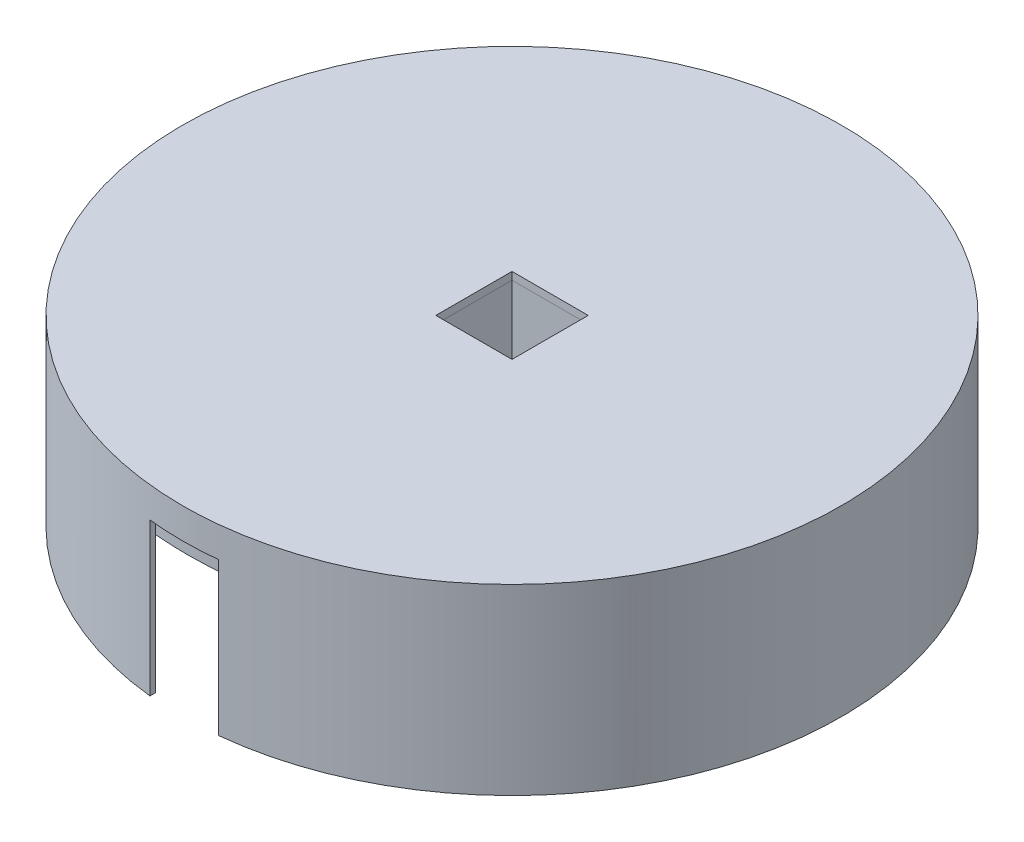
ISO-10303-21;
HEADER;
FILE_DESCRIPTION(('STEP AP214'),'2;1');
FILE_NAME('part.step','',(''),(''),'','','');
FILE_SCHEMA(('AUTOMOTIVE_DESIGN { 1 0 10303 214 1 1 1 1 }'));
ENDSEC;
DATA;
#1=APPLICATION_CONTEXT('core data for automotive mechanical design processes');
#2=APPLICATION_PROTOCOL_DEFINITION('international standard','automotive_design',2000,#1);
#3=PRODUCT_CONTEXT('',#1,'mechanical');
#4=PRODUCT('Part','Part','',(#3));
#5=PRODUCT_RELATED_PRODUCT_CATEGORY('part','',(#4));
#6=PRODUCT_DEFINITION_FORMATION('','',#4);
#7=PRODUCT_DEFINITION_CONTEXT('part definition',#1,'design');
#8=PRODUCT_DEFINITION('design','',#6,#7);
#9=PRODUCT_DEFINITION_SHAPE('','',#8);
#10=(LENGTH_UNIT() NAMED_UNIT(*) SI_UNIT(.MILLI.,.METRE.));
#11=(NAMED_UNIT(*) PLANE_ANGLE_UNIT() SI_UNIT($,.RADIAN.));
#12=(NAMED_UNIT(*) SI_UNIT($,.STERADIAN.) SOLID_ANGLE_UNIT());
#13=UNCERTAINTY_MEASURE_WITH_UNIT(LENGTH_MEASURE(1.E-05),#10,'distance_accuracy_value','');
#14=(GEOMETRIC_REPRESENTATION_CONTEXT(3) GLOBAL_UNCERTAINTY_ASSIGNED_CONTEXT((#13)) GLOBAL_UNIT_ASSIGNED_CONTEXT((#10,
#11,#12)) REPRESENTATION_CONTEXT('',''));
#15=CARTESIAN_POINT('',(0.,0.,0.));
#16=DIRECTION('',(0.,0.,1.));
#17=DIRECTION('',(1.,0.,0.));
#18=AXIS2_PLACEMENT_3D('',#15,#16,#17);
#19=CARTESIAN_POINT('',(0.,48.,0.));
#20=DIRECTION('',(0.,1.,0.));
#21=DIRECTION('',(0.,0.,1.));
#22=AXIS2_PLACEMENT_3D('',#19,#20,#21);
#23=PLANE('',#22);
#24=CARTESIAN_POINT('',(0.,48.,0.));
#25=DIRECTION('',(0.,1.,0.));
#26=DIRECTION('',(0.,0.,1.));
#27=AXIS2_PLACEMENT_3D('',#24,#25,#26);
#28=CIRCLE('',#27,86.5);
#29=CARTESIAN_POINT('',(0.,48.,86.5));
#30=VERTEX_POINT('',#29);
#31=EDGE_CURVE('P0_E135',#30,#30,#28,.T.);
#32=ORIENTED_EDGE('',*,*,#31,.T.);
#33=EDGE_LOOP('',(#32));
#34=FACE_BOUND('',#33,.T.);
#35=DIRECTION('',(-1.,0.,0.));
#36=VECTOR('',#35,1.);
#37=CARTESIAN_POINT('',(0.,48.,9.99999999999999));
#38=LINE('',#37,#36);
#39=CARTESIAN_POINT('',(10.,48.,9.99999999999999));
#40=VERTEX_POINT('',#39);
#41=CARTESIAN_POINT('',(-10.,48.,9.99999999999999));
#42=VERTEX_POINT('',#41);
#43=EDGE_CURVE('P0_E108',#40,#42,#38,.T.);
#44=ORIENTED_EDGE('',*,*,#43,.T.);
#45=DIRECTION('',(0.,0.,-1.));
#46=VECTOR('',#45,1.);
#47=CARTESIAN_POINT('',(-10.,48.,0.));
#48=LINE('',#47,#46);
#49=CARTESIAN_POINT('',(-10.,48.,-10.));
#50=VERTEX_POINT('',#49);
#51=EDGE_CURVE('P0_E102',#42,#50,#48,.T.);
#52=ORIENTED_EDGE('',*,*,#51,.T.);
#53=DIRECTION('',(1.,0.,0.));
#54=VECTOR('',#53,1.);
#55=CARTESIAN_POINT('',(0.,48.,-10.));
#56=LINE('',#55,#54);
#57=CARTESIAN_POINT('',(10.,48.,-10.));
#58=VERTEX_POINT('',#57);
#59=EDGE_CURVE('P0_E91',#50,#58,#56,.T.);
#60=ORIENTED_EDGE('',*,*,#59,.T.);
#61=DIRECTION('',(0.,0.,1.));
#62=VECTOR('',#61,1.);
#63=CARTESIAN_POINT('',(10.,48.,0.));
#64=LINE('',#63,#62);
#65=EDGE_CURVE('P0_E96',#58,#40,#64,.T.);
#66=ORIENTED_EDGE('',*,*,#65,.T.);
#67=EDGE_LOOP('',(#44,#52,#60,#66));
#68=FACE_BOUND('',#67,.T.);
#69=ADVANCED_FACE('P0_F30',(#34,#68),#23,.T.);
#70=CARTESIAN_POINT('',(0.,46.,0.));
#71=DIRECTION('',(0.,1.,0.));
#72=DIRECTION('',(0.,0.,1.));
#73=AXIS2_PLACEMENT_3D('',#70,#71,#72);
#74=PLANE('',#73);
#75=CARTESIAN_POINT('',(0.,46.,0.));
#76=DIRECTION('',(0.,1.,0.));
#77=DIRECTION('',(0.,0.,1.));
#78=AXIS2_PLACEMENT_3D('',#75,#76,#77);
#79=CIRCLE('',#78,85.);
#80=CARTESIAN_POINT('',(0.,46.,85.));
#81=VERTEX_POINT('',#80);
#82=EDGE_CURVE('P0_E109',#81,#81,#79,.T.);
#83=ORIENTED_EDGE('',*,*,#82,.F.);
#84=EDGE_LOOP('',(#83));
#85=FACE_BOUND('',#84,.T.);
#86=DIRECTION('',(0.,0.,-1.));
#87=VECTOR('',#86,1.);
#88=CARTESIAN_POINT('',(-10.,46.,0.));
#89=LINE('',#88,#87);
#90=CARTESIAN_POINT('',(-10.,46.,9.99999999999999));
#91=VERTEX_POINT('',#90);
#92=CARTESIAN_POINT('',(-10.,46.,-10.));
#93=VERTEX_POINT('',#92);
#94=EDGE_CURVE('P0_E11',#91,#93,#89,.T.);
#95=ORIENTED_EDGE('',*,*,#94,.F.);
#96=DIRECTION('',(-1.,0.,0.));
#97=VECTOR('',#96,1.);
#98=CARTESIAN_POINT('',(0.,46.,9.99999999999999));
#99=LINE('',#98,#97);
#100=CARTESIAN_POINT('',(10.,46.,9.99999999999999));
#101=VERTEX_POINT('',#100);
#102=EDGE_CURVE('P0_E38',#101,#91,#99,.T.);
#103=ORIENTED_EDGE('',*,*,#102,.F.);
#104=DIRECTION('',(0.,0.,1.));
#105=VECTOR('',#104,1.);
#106=CARTESIAN_POINT('',(10.,46.,0.));
#107=LINE('',#106,#105);
#108=CARTESIAN_POINT('',(10.,46.,-10.));
#109=VERTEX_POINT('',#108);
#110=EDGE_CURVE('P0_E153',#109,#101,#107,.T.);
#111=ORIENTED_EDGE('',*,*,#110,.F.);
#112=DIRECTION('',(1.,0.,0.));
#113=VECTOR('',#112,1.);
#114=CARTESIAN_POINT('',(0.,46.,-10.));
#115=LINE('',#114,#113);
#116=EDGE_CURVE('P0_E151',#93,#109,#115,.T.);
#117=ORIENTED_EDGE('',*,*,#116,.F.);
#118=EDGE_LOOP('',(#95,#103,#111,#117));
#119=FACE_BOUND('',#118,.T.);
#120=ADVANCED_FACE('P0_F163',(#85,#119),#74,.F.);
#121=CARTESIAN_POINT('',(0.,48.,0.));
#122=DIRECTION('',(0.,-1.,0.));
#123=DIRECTION('',(0.,0.,-1.));
#124=AXIS2_PLACEMENT_3D('',#121,#122,#123);
#125=CYLINDRICAL_SURFACE('',#124,85.);
#126=DIRECTION('',(0.,-1.,0.));
#127=VECTOR('',#126,1.);
#128=CARTESIAN_POINT('',(9.,48.,84.5221864364618));
#129=LINE('',#128,#127);
#130=CARTESIAN_POINT('',(9.,40.,84.5221864364618));
#131=VERTEX_POINT('',#130);
#132=CARTESIAN_POINT('',(9.,0.,84.5221864364618));
#133=VERTEX_POINT('',#132);
#134=EDGE_CURVE('P0_E130',#131,#133,#129,.T.);
#135=ORIENTED_EDGE('',*,*,#134,.F.);
#136=CARTESIAN_POINT('',(0.,40.,0.));
#137=DIRECTION('',(0.,1.,0.));
#138=DIRECTION('',(0.,0.,1.));
#139=AXIS2_PLACEMENT_3D('',#136,#137,#138);
#140=CIRCLE('',#139,85.);
#141=CARTESIAN_POINT('',(-9.,40.,84.5221864364618));
#142=VERTEX_POINT('',#141);
#143=EDGE_CURVE('P0_E132',#142,#131,#140,.T.);
#144=ORIENTED_EDGE('',*,*,#143,.F.);
#145=DIRECTION('',(0.,-1.,0.));
#146=VECTOR('',#145,1.);
#147=CARTESIAN_POINT('',(-9.,48.,84.5221864364618));
#148=LINE('',#147,#146);
#149=CARTESIAN_POINT('',(-9.,0.,84.5221864364618));
#150=VERTEX_POINT('',#149);
#151=EDGE_CURVE('P0_E124',#142,#150,#148,.T.);
#152=ORIENTED_EDGE('',*,*,#151,.T.);
#153=CARTESIAN_POINT('',(0.,0.,0.));
#154=DIRECTION('',(0.,1.,0.));
#155=DIRECTION('',(0.,0.,1.));
#156=AXIS2_PLACEMENT_3D('',#153,#154,#155);
#157=CIRCLE('',#156,85.);
#158=EDGE_CURVE('P0_E134',#133,#150,#157,.T.);
#159=ORIENTED_EDGE('',*,*,#158,.F.);
#160=EDGE_LOOP('',(#135,#144,#152,#159));
#161=FACE_BOUND('',#160,.T.);
#162=ORIENTED_EDGE('',*,*,#82,.T.);
#163=EDGE_LOOP('',(#162));
#164=FACE_BOUND('',#163,.T.);
#165=ADVANCED_FACE('P0_F32',(#161,#164),#125,.F.);
#166=CARTESIAN_POINT('',(0.,48.,0.));
#167=DIRECTION('',(0.,-1.,0.));
#168=DIRECTION('',(0.,0.,-1.));
#169=AXIS2_PLACEMENT_3D('',#166,#167,#168);
#170=CYLINDRICAL_SURFACE('',#169,86.5);
#171=ORIENTED_EDGE('',*,*,#31,.F.);
#172=EDGE_LOOP('',(#171));
#173=FACE_BOUND('',#172,.T.);
#174=CARTESIAN_POINT('',(0.,40.,0.));
#175=DIRECTION('',(0.,1.,0.));
#176=DIRECTION('',(0.,0.,1.));
#177=AXIS2_PLACEMENT_3D('',#174,#175,#176);
#178=CIRCLE('',#177,86.5);
#179=CARTESIAN_POINT('',(-9.,40.,86.0305178410545));
#180=VERTEX_POINT('',#179);
#181=CARTESIAN_POINT('',(9.,40.,86.0305178410545));
#182=VERTEX_POINT('',#181);
#183=EDGE_CURVE('P0_E148',#180,#182,#178,.T.);
#184=ORIENTED_EDGE('',*,*,#183,.T.);
#185=DIRECTION('',(0.,-1.,0.));
#186=VECTOR('',#185,1.);
#187=CARTESIAN_POINT('',(9.,48.,86.0305178410545));
#188=LINE('',#187,#186);
#189=CARTESIAN_POINT('',(9.,0.,86.0305178410545));
#190=VERTEX_POINT('',#189);
#191=EDGE_CURVE('P0_E127',#182,#190,#188,.T.);
#192=ORIENTED_EDGE('',*,*,#191,.T.);
#193=CARTESIAN_POINT('',(0.,0.,0.));
#194=DIRECTION('',(0.,1.,0.));
#195=DIRECTION('',(0.,0.,1.));
#196=AXIS2_PLACEMENT_3D('',#193,#194,#195);
#197=CIRCLE('',#196,86.5);
#198=CARTESIAN_POINT('',(-9.,0.,86.0305178410545));
#199=VERTEX_POINT('',#198);
#200=EDGE_CURVE('P0_E139',#190,#199,#197,.T.);
#201=ORIENTED_EDGE('',*,*,#200,.T.);
#202=DIRECTION('',(0.,-1.,0.));
#203=VECTOR('',#202,1.);
#204=CARTESIAN_POINT('',(-9.,48.,86.0305178410545));
#205=LINE('',#204,#203);
#206=EDGE_CURVE('P0_E122',#180,#199,#205,.T.);
#207=ORIENTED_EDGE('',*,*,#206,.F.);
#208=EDGE_LOOP('',(#184,#192,#201,#207));
#209=FACE_BOUND('',#208,.T.);
#210=ADVANCED_FACE('P0_F191',(#173,#209),#170,.T.);
#211=CARTESIAN_POINT('',(0.,0.,0.));
#212=DIRECTION('',(0.,1.,0.));
#213=DIRECTION('',(0.,0.,1.));
#214=AXIS2_PLACEMENT_3D('',#211,#212,#213);
#215=PLANE('',#214);
#216=ORIENTED_EDGE('',*,*,#200,.F.);
#217=DIRECTION('',(0.,0.,-1.));
#218=VECTOR('',#217,1.);
#219=CARTESIAN_POINT('',(8.99999999999998,0.,0.));
#220=LINE('',#219,#218);
#221=EDGE_CURVE('P0_E145',#190,#133,#220,.T.);
#222=ORIENTED_EDGE('',*,*,#221,.T.);
#223=ORIENTED_EDGE('',*,*,#158,.T.);
#224=DIRECTION('',(0.,0.,-1.));
#225=VECTOR('',#224,1.);
#226=CARTESIAN_POINT('',(-9.00000000000001,0.,0.));
#227=LINE('',#226,#225);
#228=EDGE_CURVE('P0_E138',#199,#150,#227,.T.);
#229=ORIENTED_EDGE('',*,*,#228,.F.);
#230=EDGE_LOOP('',(#216,#222,#223,#229));
#231=FACE_BOUND('',#230,.T.);
#232=ADVANCED_FACE('P0_F188',(#231),#215,.F.);
#233=CARTESIAN_POINT('',(0.,40.,0.));
#234=DIRECTION('',(0.,1.,0.));
#235=DIRECTION('',(0.,0.,1.));
#236=AXIS2_PLACEMENT_3D('',#233,#234,#235);
#237=PLANE('',#236);
#238=ORIENTED_EDGE('',*,*,#143,.T.);
#239=DIRECTION('',(0.,0.,1.));
#240=VECTOR('',#239,1.);
#241=CARTESIAN_POINT('',(8.99999999999998,40.,0.));
#242=LINE('',#241,#240);
#243=EDGE_CURVE('P0_E112',#131,#182,#242,.T.);
#244=ORIENTED_EDGE('',*,*,#243,.T.);
#245=ORIENTED_EDGE('',*,*,#183,.F.);
#246=DIRECTION('',(0.,0.,1.));
#247=VECTOR('',#246,1.);
#248=CARTESIAN_POINT('',(-9.00000000000001,40.,0.));
#249=LINE('',#248,#247);
#250=EDGE_CURVE('P0_E119',#142,#180,#249,.T.);
#251=ORIENTED_EDGE('',*,*,#250,.F.);
#252=EDGE_LOOP('',(#238,#244,#245,#251));
#253=FACE_BOUND('',#252,.T.);
#254=ADVANCED_FACE('P0_F190',(#253),#237,.F.);
#255=CARTESIAN_POINT('',(8.99999999999998,40.,0.));
#256=DIRECTION('',(1.,0.,0.));
#257=DIRECTION('',(0.,0.,-1.));
#258=AXIS2_PLACEMENT_3D('',#255,#256,#257);
#259=PLANE('',#258);
#260=ORIENTED_EDGE('',*,*,#134,.T.);
#261=ORIENTED_EDGE('',*,*,#221,.F.);
#262=ORIENTED_EDGE('',*,*,#191,.F.);
#263=ORIENTED_EDGE('',*,*,#243,.F.);
#264=EDGE_LOOP('',(#260,#261,#262,#263));
#265=FACE_BOUND('',#264,.T.);
#266=ADVANCED_FACE('P0_F186',(#265),#259,.F.);
#267=CARTESIAN_POINT('',(-9.00000000000001,40.,0.));
#268=DIRECTION('',(1.,0.,0.));
#269=DIRECTION('',(0.,0.,-1.));
#270=AXIS2_PLACEMENT_3D('',#267,#268,#269);
#271=PLANE('',#270);
#272=ORIENTED_EDGE('',*,*,#250,.T.);
#273=ORIENTED_EDGE('',*,*,#206,.T.);
#274=ORIENTED_EDGE('',*,*,#228,.T.);
#275=ORIENTED_EDGE('',*,*,#151,.F.);
#276=EDGE_LOOP('',(#272,#273,#274,#275));
#277=FACE_BOUND('',#276,.T.);
#278=ADVANCED_FACE('P0_F208',(#277),#271,.T.);
#279=CARTESIAN_POINT('',(-10.,70.,-10.));
#280=DIRECTION('',(1.,0.,0.));
#281=DIRECTION('',(0.,0.,-1.));
#282=AXIS2_PLACEMENT_3D('',#279,#280,#281);
#283=PLANE('',#282);
#284=DIRECTION('',(0.,-1.,0.));
#285=VECTOR('',#284,1.);
#286=CARTESIAN_POINT('',(-10.,70.,9.99999999999999));
#287=LINE('',#286,#285);
#288=EDGE_CURVE('P0_E97',#42,#91,#287,.T.);
#289=ORIENTED_EDGE('',*,*,#288,.T.);
#290=ORIENTED_EDGE('',*,*,#94,.T.);
#291=DIRECTION('',(0.,-1.,0.));
#292=VECTOR('',#291,1.);
#293=CARTESIAN_POINT('',(-10.,70.,-10.));
#294=LINE('',#293,#292);
#295=EDGE_CURVE('P0_E50',#50,#93,#294,.T.);
#296=ORIENTED_EDGE('',*,*,#295,.F.);
#297=ORIENTED_EDGE('',*,*,#51,.F.);
#298=EDGE_LOOP('',(#289,#290,#296,#297));
#299=FACE_BOUND('',#298,.T.);
#300=ADVANCED_FACE('P0_F101',(#299),#283,.T.);
#301=CARTESIAN_POINT('',(-10.,70.,9.99999999999999));
#302=DIRECTION('',(0.,0.,-1.));
#303=DIRECTION('',(-1.,0.,0.));
#304=AXIS2_PLACEMENT_3D('',#301,#302,#303);
#305=PLANE('',#304);
#306=DIRECTION('',(0.,-1.,0.));
#307=VECTOR('',#306,1.);
#308=CARTESIAN_POINT('',(10.,70.,9.99999999999999));
#309=LINE('',#308,#307);
#310=EDGE_CURVE('P0_E159',#40,#101,#309,.T.);
#311=ORIENTED_EDGE('',*,*,#310,.T.);
#312=ORIENTED_EDGE('',*,*,#102,.T.);
#313=ORIENTED_EDGE('',*,*,#288,.F.);
#314=ORIENTED_EDGE('',*,*,#43,.F.);
#315=EDGE_LOOP('',(#311,#312,#313,#314));
#316=FACE_BOUND('',#315,.T.);
#317=ADVANCED_FACE('P0_F157',(#316),#305,.T.);
#318=CARTESIAN_POINT('',(10.,70.,-10.));
#319=DIRECTION('',(-1.,0.,0.));
#320=DIRECTION('',(0.,0.,1.));
#321=AXIS2_PLACEMENT_3D('',#318,#319,#320);
#322=PLANE('',#321);
#323=DIRECTION('',(0.,-1.,0.));
#324=VECTOR('',#323,1.);
#325=CARTESIAN_POINT('',(10.,70.,-10.));
#326=LINE('',#325,#324);
#327=EDGE_CURVE('P0_E45',#58,#109,#326,.T.);
#328=ORIENTED_EDGE('',*,*,#327,.T.);
#329=ORIENTED_EDGE('',*,*,#110,.T.);
#330=ORIENTED_EDGE('',*,*,#310,.F.);
#331=ORIENTED_EDGE('',*,*,#65,.F.);
#332=EDGE_LOOP('',(#328,#329,#330,#331));
#333=FACE_BOUND('',#332,.T.);
#334=ADVANCED_FACE('P0_F165',(#333),#322,.T.);
#335=CARTESIAN_POINT('',(-10.,70.,-10.));
#336=DIRECTION('',(0.,0.,1.));
#337=DIRECTION('',(1.,0.,0.));
#338=AXIS2_PLACEMENT_3D('',#335,#336,#337);
#339=PLANE('',#338);
#340=ORIENTED_EDGE('',*,*,#295,.T.);
#341=ORIENTED_EDGE('',*,*,#116,.T.);
#342=ORIENTED_EDGE('',*,*,#327,.F.);
#343=ORIENTED_EDGE('',*,*,#59,.F.);
#344=EDGE_LOOP('',(#340,#341,#342,#343));
#345=FACE_BOUND('',#344,.T.);
#346=ADVANCED_FACE('P0_F92',(#345),#339,.T.);
#347=CLOSED_SHELL('',(#69,#120,#165,#210,#232,#254,#266,#278,#300,#317,#334,#346));
#348=MANIFOLD_SOLID_BREP('P0_B2',#347);
#349=CARTESIAN_POINT('',(0.,6.,0.));
#350=DIRECTION('',(0.,1.,0.));
#351=DIRECTION('',(-1.,0.,0.));
#352=AXIS2_PLACEMENT_3D('',#349,#350,#351);
#353=CYLINDRICAL_SURFACE('',#352,85.);
#354=CARTESIAN_POINT('',(0.,21.0122066397804,0.));
#355=DIRECTION('',(0.,0.984807753012208,-0.173648177666931));
#356=DIRECTION('',(0.,0.173648177666931,0.984807753012208));
#357=AXIS2_PLACEMENT_3D('',#354,#355,#356);
#358=ELLIPSE('',#357,86.3112620102883,85.);
#359=CARTESIAN_POINT('',(0.,36.,85.));
#360=VERTEX_POINT('',#359);
#361=EDGE_CURVE('P1_E61',#360,#360,#358,.T.);
#362=ORIENTED_EDGE('',*,*,#361,.T.);
#363=EDGE_LOOP('',(#362));
#364=FACE_BOUND('',#363,.T.);
#365=CARTESIAN_POINT('',(0.,46.,0.));
#366=DIRECTION('',(0.,-1.,0.));
#367=DIRECTION('',(1.,0.,0.));
#368=AXIS2_PLACEMENT_3D('',#365,#366,#367);
#369=CIRCLE('',#368,85.);
#370=CARTESIAN_POINT('',(85.,46.,0.));
#371=VERTEX_POINT('',#370);
#372=EDGE_CURVE('P1_E80',#371,#371,#369,.T.);
#373=ORIENTED_EDGE('',*,*,#372,.T.);
#374=EDGE_LOOP('',(#373));
#375=FACE_BOUND('',#374,.T.);
#376=ADVANCED_FACE('P1_F18',(#364,#375),#353,.T.);
#377=CARTESIAN_POINT('',(0.,46.,0.));
#378=DIRECTION('',(0.,-1.,0.));
#379=DIRECTION('',(1.,0.,0.));
#380=AXIS2_PLACEMENT_3D('',#377,#378,#379);
#381=PLANE('',#380);
#382=DIRECTION('',(0.,0.,1.));
#383=VECTOR('',#382,1.);
#384=CARTESIAN_POINT('',(10.,46.,0.));
#385=LINE('',#384,#383);
#386=CARTESIAN_POINT('',(10.,46.,-10.));
#387=VERTEX_POINT('',#386);
#388=CARTESIAN_POINT('',(10.,46.,10.));
#389=VERTEX_POINT('',#388);
#390=EDGE_CURVE('P1_E91',#387,#389,#385,.T.);
#391=ORIENTED_EDGE('',*,*,#390,.T.);
#392=DIRECTION('',(-1.,0.,0.));
#393=VECTOR('',#392,1.);
#394=CARTESIAN_POINT('',(0.,46.,10.));
#395=LINE('',#394,#393);
#396=CARTESIAN_POINT('',(-10.,46.,10.));
#397=VERTEX_POINT('',#396);
#398=EDGE_CURVE('P1_E88',#389,#397,#395,.T.);
#399=ORIENTED_EDGE('',*,*,#398,.T.);
#400=DIRECTION('',(0.,0.,-1.));
#401=VECTOR('',#400,1.);
#402=CARTESIAN_POINT('',(-10.,46.,0.));
#403=LINE('',#402,#401);
#404=CARTESIAN_POINT('',(-10.,46.,-10.));
#405=VERTEX_POINT('',#404);
#406=EDGE_CURVE('P1_E95',#397,#405,#403,.T.);
#407=ORIENTED_EDGE('',*,*,#406,.T.);
#408=DIRECTION('',(1.,0.,0.));
#409=VECTOR('',#408,1.);
#410=CARTESIAN_POINT('',(0.,46.,-10.));
#411=LINE('',#410,#409);
#412=EDGE_CURVE('P1_E68',#405,#387,#411,.T.);
#413=ORIENTED_EDGE('',*,*,#412,.T.);
#414=EDGE_LOOP('',(#391,#399,#407,#413));
#415=FACE_BOUND('',#414,.T.);
#416=ORIENTED_EDGE('',*,*,#372,.F.);
#417=EDGE_LOOP('',(#416));
#418=FACE_BOUND('',#417,.T.);
#419=ADVANCED_FACE('P1_F107',(#415,#418),#381,.F.);
#420=CARTESIAN_POINT('',(-110.,21.7656808047295,4.27316433322724));
#421=DIRECTION('',(0.,0.984807753012208,-0.173648177666931));
#422=DIRECTION('',(0.,0.173648177666931,0.984807753012208));
#423=AXIS2_PLACEMENT_3D('',#420,#421,#422);
#424=PLANE('',#423);
#425=CARTESIAN_POINT('',(0.,21.0122066397804,0.));
#426=DIRECTION('',(0.,0.984807753012208,-0.173648177666931));
#427=DIRECTION('',(0.,0.173648177666931,0.984807753012208));
#428=AXIS2_PLACEMENT_3D('',#425,#426,#427);
#429=ELLIPSE('',#428,15.2313991782862,15.);
#430=CARTESIAN_POINT('',(0.,23.6571113504074,15.));
#431=VERTEX_POINT('',#430);
#432=EDGE_CURVE('P1_E77',#431,#431,#429,.T.);
#433=ORIENTED_EDGE('',*,*,#432,.T.);
#434=EDGE_LOOP('',(#433));
#435=FACE_BOUND('',#434,.T.);
#436=ORIENTED_EDGE('',*,*,#361,.F.);
#437=EDGE_LOOP('',(#436));
#438=FACE_BOUND('',#437,.T.);
#439=ADVANCED_FACE('P1_F110',(#435,#438),#424,.F.);
#440=CARTESIAN_POINT('',(0.,-2.,0.));
#441=DIRECTION('',(0.,1.,0.));
#442=DIRECTION('',(-1.,0.,0.));
#443=AXIS2_PLACEMENT_3D('',#440,#441,#442);
#444=CYLINDRICAL_SURFACE('',#443,15.);
#445=CARTESIAN_POINT('',(0.,-2.,0.));
#446=DIRECTION('',(0.,1.,0.));
#447=DIRECTION('',(-1.,0.,0.));
#448=AXIS2_PLACEMENT_3D('',#445,#446,#447);
#449=CIRCLE('',#448,15.);
#450=CARTESIAN_POINT('',(-15.,-2.,0.));
#451=VERTEX_POINT('',#450);
#452=EDGE_CURVE('P1_E81',#451,#451,#449,.T.);
#453=ORIENTED_EDGE('',*,*,#452,.T.);
#454=EDGE_LOOP('',(#453));
#455=FACE_BOUND('',#454,.T.);
#456=ORIENTED_EDGE('',*,*,#432,.F.);
#457=EDGE_LOOP('',(#456));
#458=FACE_BOUND('',#457,.T.);
#459=ADVANCED_FACE('P1_F121',(#455,#458),#444,.T.);
#460=CARTESIAN_POINT('',(0.,-2.,0.));
#461=DIRECTION('',(0.,1.,0.));
#462=DIRECTION('',(-1.,0.,0.));
#463=AXIS2_PLACEMENT_3D('',#460,#461,#462);
#464=PLANE('',#463);
#465=DIRECTION('',(0.,0.,1.));
#466=VECTOR('',#465,1.);
#467=CARTESIAN_POINT('',(-10.,-2.,0.));
#468=LINE('',#467,#466);
#469=CARTESIAN_POINT('',(-10.,-2.00000000000001,-10.));
#470=VERTEX_POINT('',#469);
#471=CARTESIAN_POINT('',(-10.,-2.,9.99999999999999));
#472=VERTEX_POINT('',#471);
#473=EDGE_CURVE('P1_E56',#470,#472,#468,.T.);
#474=ORIENTED_EDGE('',*,*,#473,.T.);
#475=DIRECTION('',(1.,0.,0.));
#476=VECTOR('',#475,1.);
#477=CARTESIAN_POINT('',(0.,-2.,9.99999999999999));
#478=LINE('',#477,#476);
#479=CARTESIAN_POINT('',(10.,-2.00000000000001,9.99999999999999));
#480=VERTEX_POINT('',#479);
#481=EDGE_CURVE('P1_E12',#472,#480,#478,.T.);
#482=ORIENTED_EDGE('',*,*,#481,.T.);
#483=DIRECTION('',(0.,0.,-1.));
#484=VECTOR('',#483,1.);
#485=CARTESIAN_POINT('',(10.,-2.,0.));
#486=LINE('',#485,#484);
#487=CARTESIAN_POINT('',(10.,-2.00000000000001,-10.));
#488=VERTEX_POINT('',#487);
#489=EDGE_CURVE('P1_E26',#480,#488,#486,.T.);
#490=ORIENTED_EDGE('',*,*,#489,.T.);
#491=DIRECTION('',(-1.,0.,0.));
#492=VECTOR('',#491,1.);
#493=CARTESIAN_POINT('',(0.,-2.,-10.));
#494=LINE('',#493,#492);
#495=EDGE_CURVE('P1_E60',#488,#470,#494,.T.);
#496=ORIENTED_EDGE('',*,*,#495,.T.);
#497=EDGE_LOOP('',(#474,#482,#490,#496));
#498=FACE_BOUND('',#497,.T.);
#499=ORIENTED_EDGE('',*,*,#452,.F.);
#500=EDGE_LOOP('',(#499));
#501=FACE_BOUND('',#500,.T.);
#502=ADVANCED_FACE('P1_F73',(#498,#501),#464,.F.);
#503=CARTESIAN_POINT('',(10.,61.,10.));
#504=DIRECTION('',(0.,0.,1.));
#505=DIRECTION('',(-1.,0.,0.));
#506=AXIS2_PLACEMENT_3D('',#503,#504,#505);
#507=PLANE('',#506);
#508=DIRECTION('',(0.,-1.,0.));
#509=VECTOR('',#508,1.);
#510=CARTESIAN_POINT('',(10.,61.,10.));
#511=LINE('',#510,#509);
#512=EDGE_CURVE('P1_E97',#389,#480,#511,.T.);
#513=ORIENTED_EDGE('',*,*,#512,.T.);
#514=ORIENTED_EDGE('',*,*,#481,.F.);
#515=DIRECTION('',(0.,-1.,0.));
#516=VECTOR('',#515,1.);
#517=CARTESIAN_POINT('',(-10.,61.,10.));
#518=LINE('',#517,#516);
#519=EDGE_CURVE('P1_E38',#397,#472,#518,.T.);
#520=ORIENTED_EDGE('',*,*,#519,.F.);
#521=ORIENTED_EDGE('',*,*,#398,.F.);
#522=EDGE_LOOP('',(#513,#514,#520,#521));
#523=FACE_BOUND('',#522,.T.);
#524=ADVANCED_FACE('P1_F103',(#523),#507,.F.);
#525=CARTESIAN_POINT('',(10.,61.,-10.));
#526=DIRECTION('',(1.,0.,0.));
#527=DIRECTION('',(0.,0.,1.));
#528=AXIS2_PLACEMENT_3D('',#525,#526,#527);
#529=PLANE('',#528);
#530=DIRECTION('',(0.,-1.,0.));
#531=VECTOR('',#530,1.);
#532=CARTESIAN_POINT('',(10.,61.,-10.));
#533=LINE('',#532,#531);
#534=EDGE_CURVE('P1_E70',#387,#488,#533,.T.);
#535=ORIENTED_EDGE('',*,*,#534,.T.);
#536=ORIENTED_EDGE('',*,*,#489,.F.);
#537=ORIENTED_EDGE('',*,*,#512,.F.);
#538=ORIENTED_EDGE('',*,*,#390,.F.);
#539=EDGE_LOOP('',(#535,#536,#537,#538));
#540=FACE_BOUND('',#539,.T.);
#541=ADVANCED_FACE('P1_F105',(#540),#529,.F.);
#542=CARTESIAN_POINT('',(10.,61.,-10.));
#543=DIRECTION('',(0.,0.,-1.));
#544=DIRECTION('',(1.,0.,0.));
#545=AXIS2_PLACEMENT_3D('',#542,#543,#544);
#546=PLANE('',#545);
#547=DIRECTION('',(0.,-1.,0.));
#548=VECTOR('',#547,1.);
#549=CARTESIAN_POINT('',(-10.,61.,-10.));
#550=LINE('',#549,#548);
#551=EDGE_CURVE('P1_E33',#405,#470,#550,.T.);
#552=ORIENTED_EDGE('',*,*,#551,.T.);
#553=ORIENTED_EDGE('',*,*,#495,.F.);
#554=ORIENTED_EDGE('',*,*,#534,.F.);
#555=ORIENTED_EDGE('',*,*,#412,.F.);
#556=EDGE_LOOP('',(#552,#553,#554,#555));
#557=FACE_BOUND('',#556,.T.);
#558=ADVANCED_FACE('P1_F64',(#557),#546,.F.);
#559=CARTESIAN_POINT('',(-10.,61.,-10.));
#560=DIRECTION('',(-1.,0.,0.));
#561=DIRECTION('',(0.,0.,-1.));
#562=AXIS2_PLACEMENT_3D('',#559,#560,#561);
#563=PLANE('',#562);
#564=ORIENTED_EDGE('',*,*,#519,.T.);
#565=ORIENTED_EDGE('',*,*,#473,.F.);
#566=ORIENTED_EDGE('',*,*,#551,.F.);
#567=ORIENTED_EDGE('',*,*,#406,.F.);
#568=EDGE_LOOP('',(#564,#565,#566,#567));
#569=FACE_BOUND('',#568,.T.);
#570=ADVANCED_FACE('P1_F57',(#569),#563,.F.);
#571=CLOSED_SHELL('',(#376,#419,#439,#459,#502,#524,#541,#558,#570));
#572=MANIFOLD_SOLID_BREP('P1_B1',#571);
#573=ADVANCED_BREP_SHAPE_REPRESENTATION('',(#18,#348,#572),#14);
#574=SHAPE_DEFINITION_REPRESENTATION(#9,#573);
ENDSEC;
END-ISO-10303-21;
